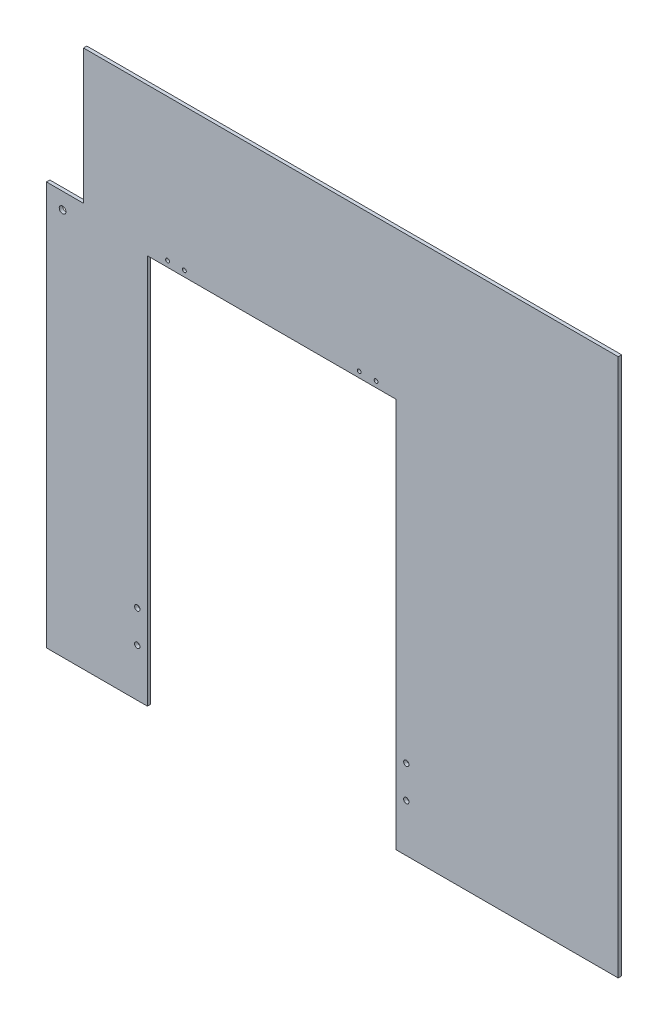
ISO-10303-21;
HEADER;
FILE_DESCRIPTION(('STEP AP214'),'2;1');
FILE_NAME('part.step','',(''),(''),'','','');
FILE_SCHEMA(('AUTOMOTIVE_DESIGN { 1 0 10303 214 1 1 1 1 }'));
ENDSEC;
DATA;
#1=APPLICATION_CONTEXT('core data for automotive mechanical design processes');
#2=APPLICATION_PROTOCOL_DEFINITION('international standard','automotive_design',2000,#1);
#3=PRODUCT_CONTEXT('',#1,'mechanical');
#4=PRODUCT('Part','Part','',(#3));
#5=PRODUCT_RELATED_PRODUCT_CATEGORY('part','',(#4));
#6=PRODUCT_DEFINITION_FORMATION('','',#4);
#7=PRODUCT_DEFINITION_CONTEXT('part definition',#1,'design');
#8=PRODUCT_DEFINITION('design','',#6,#7);
#9=PRODUCT_DEFINITION_SHAPE('','',#8);
#10=(LENGTH_UNIT() NAMED_UNIT(*) SI_UNIT(.MILLI.,.METRE.));
#11=(NAMED_UNIT(*) PLANE_ANGLE_UNIT() SI_UNIT($,.RADIAN.));
#12=(NAMED_UNIT(*) SI_UNIT($,.STERADIAN.) SOLID_ANGLE_UNIT());
#13=UNCERTAINTY_MEASURE_WITH_UNIT(LENGTH_MEASURE(1.E-05),#10,'distance_accuracy_value','');
#14=(GEOMETRIC_REPRESENTATION_CONTEXT(3) GLOBAL_UNCERTAINTY_ASSIGNED_CONTEXT((#13)) GLOBAL_UNIT_ASSIGNED_CONTEXT((#10,
#11,#12)) REPRESENTATION_CONTEXT('',''));
#15=CARTESIAN_POINT('',(0.,0.,0.));
#16=DIRECTION('',(0.,0.,1.));
#17=DIRECTION('',(1.,0.,0.));
#18=AXIS2_PLACEMENT_3D('',#15,#16,#17);
#19=CARTESIAN_POINT('',(0.,0.,3.175));
#20=DIRECTION('',(0.,1.,0.));
#21=DIRECTION('',(0.,0.,1.));
#22=AXIS2_PLACEMENT_3D('',#19,#20,#21);
#23=PLANE('',#22);
#24=DIRECTION('',(1.,0.,0.));
#25=VECTOR('',#24,1.);
#26=CARTESIAN_POINT('',(0.,0.,0.));
#27=LINE('',#26,#25);
#28=CARTESIAN_POINT('',(0.,0.,0.));
#29=VERTEX_POINT('',#28);
#30=CARTESIAN_POINT('',(95.2500000000001,-1.02649894704531E-13,0.));
#31=VERTEX_POINT('',#30);
#32=EDGE_CURVE('E162',#29,#31,#27,.T.);
#33=ORIENTED_EDGE('',*,*,#32,.T.);
#34=DIRECTION('',(0.,0.,-1.));
#35=VECTOR('',#34,1.);
#36=CARTESIAN_POINT('',(95.2500000000001,-1.02649894704531E-13,44.45));
#37=LINE('',#36,#35);
#38=CARTESIAN_POINT('',(95.2500000000001,-1.02649894704531E-13,3.175));
#39=VERTEX_POINT('',#38);
#40=EDGE_CURVE('E221',#39,#31,#37,.T.);
#41=ORIENTED_EDGE('',*,*,#40,.F.);
#42=DIRECTION('',(1.,0.,0.));
#43=VECTOR('',#42,1.);
#44=CARTESIAN_POINT('',(0.,0.,3.175));
#45=LINE('',#44,#43);
#46=CARTESIAN_POINT('',(0.,0.,3.175));
#47=VERTEX_POINT('',#46);
#48=EDGE_CURVE('E153',#47,#39,#45,.T.);
#49=ORIENTED_EDGE('',*,*,#48,.F.);
#50=DIRECTION('',(0.,0.,-1.));
#51=VECTOR('',#50,1.);
#52=CARTESIAN_POINT('',(0.,0.,3.175));
#53=LINE('',#52,#51);
#54=EDGE_CURVE('E11',#47,#29,#53,.T.);
#55=ORIENTED_EDGE('',*,*,#54,.T.);
#56=EDGE_LOOP('',(#33,#41,#49,#55));
#57=FACE_BOUND('',#56,.T.);
#58=ADVANCED_FACE('F43',(#57),#23,.F.);
#59=CARTESIAN_POINT('',(0.,0.,3.175));
#60=DIRECTION('',(1.,0.,0.));
#61=DIRECTION('',(0.,0.,-1.));
#62=AXIS2_PLACEMENT_3D('',#59,#60,#61);
#63=PLANE('',#62);
#64=DIRECTION('',(0.,-1.,0.));
#65=VECTOR('',#64,1.);
#66=CARTESIAN_POINT('',(0.,0.,3.175));
#67=LINE('',#66,#65);
#68=CARTESIAN_POINT('',(0.,381.,3.175));
#69=VERTEX_POINT('',#68);
#70=EDGE_CURVE('E170',#69,#47,#67,.T.);
#71=ORIENTED_EDGE('',*,*,#70,.F.);
#72=DIRECTION('',(0.,0.,-1.));
#73=VECTOR('',#72,1.);
#74=CARTESIAN_POINT('',(0.,381.,3.175));
#75=LINE('',#74,#73);
#76=CARTESIAN_POINT('',(0.,381.,0.));
#77=VERTEX_POINT('',#76);
#78=EDGE_CURVE('E198',#69,#77,#75,.T.);
#79=ORIENTED_EDGE('',*,*,#78,.T.);
#80=DIRECTION('',(0.,-1.,0.));
#81=VECTOR('',#80,1.);
#82=CARTESIAN_POINT('',(0.,0.,0.));
#83=LINE('',#82,#81);
#84=EDGE_CURVE('E157',#77,#29,#83,.T.);
#85=ORIENTED_EDGE('',*,*,#84,.T.);
#86=ORIENTED_EDGE('',*,*,#54,.F.);
#87=EDGE_LOOP('',(#71,#79,#85,#86));
#88=FACE_BOUND('',#87,.T.);
#89=ADVANCED_FACE('F45',(#88),#63,.F.);
#90=CARTESIAN_POINT('',(330.2,0.,3.175));
#91=VERTEX_POINT('',#90);
#92=CARTESIAN_POINT('',(539.75,0.,3.175));
#93=VERTEX_POINT('',#92);
#94=EDGE_CURVE('E278',#91,#93,#45,.T.);
#95=ORIENTED_EDGE('',*,*,#94,.F.);
#96=DIRECTION('',(0.,0.,-1.));
#97=VECTOR('',#96,1.);
#98=CARTESIAN_POINT('',(330.2,0.,44.45));
#99=LINE('',#98,#97);
#100=CARTESIAN_POINT('',(330.2,0.,0.));
#101=VERTEX_POINT('',#100);
#102=EDGE_CURVE('E234',#91,#101,#99,.T.);
#103=ORIENTED_EDGE('',*,*,#102,.T.);
#104=CARTESIAN_POINT('',(539.75,0.,0.));
#105=VERTEX_POINT('',#104);
#106=EDGE_CURVE('E160',#101,#105,#27,.T.);
#107=ORIENTED_EDGE('',*,*,#106,.T.);
#108=DIRECTION('',(0.,0.,-1.));
#109=VECTOR('',#108,1.);
#110=CARTESIAN_POINT('',(539.75,0.,3.175));
#111=LINE('',#110,#109);
#112=EDGE_CURVE('E52',#93,#105,#111,.T.);
#113=ORIENTED_EDGE('',*,*,#112,.F.);
#114=EDGE_LOOP('',(#95,#103,#107,#113));
#115=FACE_BOUND('',#114,.T.);
#116=ADVANCED_FACE('F283',(#115),#23,.F.);
#117=CARTESIAN_POINT('',(539.75,0.,3.175));
#118=DIRECTION('',(-1.,0.,0.));
#119=DIRECTION('',(0.,0.,1.));
#120=AXIS2_PLACEMENT_3D('',#117,#118,#119);
#121=PLANE('',#120);
#122=DIRECTION('',(0.,1.,0.));
#123=VECTOR('',#122,1.);
#124=CARTESIAN_POINT('',(539.75,0.,0.));
#125=LINE('',#124,#123);
#126=CARTESIAN_POINT('',(539.75,508.,0.));
#127=VERTEX_POINT('',#126);
#128=EDGE_CURVE('E166',#105,#127,#125,.T.);
#129=ORIENTED_EDGE('',*,*,#128,.T.);
#130=DIRECTION('',(0.,0.,-1.));
#131=VECTOR('',#130,1.);
#132=CARTESIAN_POINT('',(539.75,508.,3.175));
#133=LINE('',#132,#131);
#134=CARTESIAN_POINT('',(539.75,508.,3.175));
#135=VERTEX_POINT('',#134);
#136=EDGE_CURVE('E148',#135,#127,#133,.T.);
#137=ORIENTED_EDGE('',*,*,#136,.F.);
#138=DIRECTION('',(0.,1.,0.));
#139=VECTOR('',#138,1.);
#140=CARTESIAN_POINT('',(539.75,0.,3.175));
#141=LINE('',#140,#139);
#142=EDGE_CURVE('E145',#93,#135,#141,.T.);
#143=ORIENTED_EDGE('',*,*,#142,.F.);
#144=ORIENTED_EDGE('',*,*,#112,.T.);
#145=EDGE_LOOP('',(#129,#137,#143,#144));
#146=FACE_BOUND('',#145,.T.);
#147=ADVANCED_FACE('F176',(#146),#121,.F.);
#148=CARTESIAN_POINT('',(0.,508.,3.175));
#149=DIRECTION('',(0.,-1.,0.));
#150=DIRECTION('',(0.,0.,-1.));
#151=AXIS2_PLACEMENT_3D('',#148,#149,#150);
#152=PLANE('',#151);
#153=DIRECTION('',(-1.,0.,0.));
#154=VECTOR('',#153,1.);
#155=CARTESIAN_POINT('',(0.,508.,0.));
#156=LINE('',#155,#154);
#157=CARTESIAN_POINT('',(34.925,508.,0.));
#158=VERTEX_POINT('',#157);
#159=EDGE_CURVE('E139',#127,#158,#156,.T.);
#160=ORIENTED_EDGE('',*,*,#159,.T.);
#161=DIRECTION('',(0.,0.,-1.));
#162=VECTOR('',#161,1.);
#163=CARTESIAN_POINT('',(34.925,508.,3.175));
#164=LINE('',#163,#162);
#165=CARTESIAN_POINT('',(34.925,508.,3.175));
#166=VERTEX_POINT('',#165);
#167=EDGE_CURVE('E59',#166,#158,#164,.T.);
#168=ORIENTED_EDGE('',*,*,#167,.F.);
#169=DIRECTION('',(-1.,0.,0.));
#170=VECTOR('',#169,1.);
#171=CARTESIAN_POINT('',(0.,508.,3.175));
#172=LINE('',#171,#170);
#173=EDGE_CURVE('E137',#135,#166,#172,.T.);
#174=ORIENTED_EDGE('',*,*,#173,.F.);
#175=ORIENTED_EDGE('',*,*,#136,.T.);
#176=EDGE_LOOP('',(#160,#168,#174,#175));
#177=FACE_BOUND('',#176,.T.);
#178=ADVANCED_FACE('F135',(#177),#152,.F.);
#179=CARTESIAN_POINT('',(0.,0.,3.175));
#180=DIRECTION('',(0.,0.,-1.));
#181=DIRECTION('',(-1.,0.,0.));
#182=AXIS2_PLACEMENT_3D('',#179,#180,#181);
#183=PLANE('',#182);
#184=CARTESIAN_POINT('',(311.1754,373.8372,3.175));
#185=DIRECTION('',(0.,0.,-1.));
#186=DIRECTION('',(-1.,0.,0.));
#187=AXIS2_PLACEMENT_3D('',#184,#185,#186);
#188=CIRCLE('',#187,1.80340000000004);
#189=CARTESIAN_POINT('',(309.372,373.8372,3.175));
#190=VERTEX_POINT('',#189);
#191=EDGE_CURVE('E188',#190,#190,#188,.T.);
#192=ORIENTED_EDGE('',*,*,#191,.T.);
#193=EDGE_LOOP('',(#192));
#194=FACE_BOUND('',#193,.T.);
#195=CARTESIAN_POINT('',(295.3004,373.8372,3.175));
#196=DIRECTION('',(0.,0.,-1.));
#197=DIRECTION('',(-1.,0.,0.));
#198=AXIS2_PLACEMENT_3D('',#195,#196,#197);
#199=CIRCLE('',#198,1.80340000000004);
#200=CARTESIAN_POINT('',(293.497,373.8372,3.175));
#201=VERTEX_POINT('',#200);
#202=EDGE_CURVE('E532',#201,#201,#199,.T.);
#203=ORIENTED_EDGE('',*,*,#202,.T.);
#204=EDGE_LOOP('',(#203));
#205=FACE_BOUND('',#204,.T.);
#206=CARTESIAN_POINT('',(130.2004,373.8372,3.175));
#207=DIRECTION('',(0.,0.,-1.));
#208=DIRECTION('',(-1.,0.,0.));
#209=AXIS2_PLACEMENT_3D('',#206,#207,#208);
#210=CIRCLE('',#209,1.80340000000004);
#211=CARTESIAN_POINT('',(128.397,373.8372,3.175));
#212=VERTEX_POINT('',#211);
#213=EDGE_CURVE('E542',#212,#212,#210,.T.);
#214=ORIENTED_EDGE('',*,*,#213,.T.);
#215=EDGE_LOOP('',(#214));
#216=FACE_BOUND('',#215,.T.);
#217=CARTESIAN_POINT('',(114.3254,373.8372,3.175));
#218=DIRECTION('',(0.,0.,-1.));
#219=DIRECTION('',(-1.,0.,0.));
#220=AXIS2_PLACEMENT_3D('',#217,#218,#219);
#221=CIRCLE('',#220,1.80340000000004);
#222=CARTESIAN_POINT('',(112.522,373.8372,3.175));
#223=VERTEX_POINT('',#222);
#224=EDGE_CURVE('E550',#223,#223,#221,.T.);
#225=ORIENTED_EDGE('',*,*,#224,.T.);
#226=EDGE_LOOP('',(#225));
#227=FACE_BOUND('',#226,.T.);
#228=CARTESIAN_POINT('',(85.7250000000001,45.085,3.175));
#229=DIRECTION('',(0.,0.,-1.));
#230=DIRECTION('',(-1.,0.,0.));
#231=AXIS2_PLACEMENT_3D('',#228,#229,#230);
#232=CIRCLE('',#231,2.53999999999998);
#233=CARTESIAN_POINT('',(83.1850000000001,45.085,3.175));
#234=VERTEX_POINT('',#233);
#235=EDGE_CURVE('E161',#234,#234,#232,.T.);
#236=ORIENTED_EDGE('',*,*,#235,.T.);
#237=EDGE_LOOP('',(#236));
#238=FACE_BOUND('',#237,.T.);
#239=CARTESIAN_POINT('',(15.24,365.76,3.175));
#240=DIRECTION('',(0.,0.,-1.));
#241=DIRECTION('',(-1.,0.,0.));
#242=AXIS2_PLACEMENT_3D('',#239,#240,#241);
#243=CIRCLE('',#242,3.175);
#244=CARTESIAN_POINT('',(12.065,365.76,3.175));
#245=VERTEX_POINT('',#244);
#246=EDGE_CURVE('E270',#245,#245,#243,.T.);
#247=ORIENTED_EDGE('',*,*,#246,.T.);
#248=EDGE_LOOP('',(#247));
#249=FACE_BOUND('',#248,.T.);
#250=CARTESIAN_POINT('',(339.725,75.565,3.175));
#251=DIRECTION('',(0.,0.,-1.));
#252=DIRECTION('',(-1.,0.,0.));
#253=AXIS2_PLACEMENT_3D('',#250,#251,#252);
#254=CIRCLE('',#253,2.54000000000001);
#255=CARTESIAN_POINT('',(337.185,75.565,3.175));
#256=VERTEX_POINT('',#255);
#257=EDGE_CURVE('E266',#256,#256,#254,.T.);
#258=ORIENTED_EDGE('',*,*,#257,.T.);
#259=EDGE_LOOP('',(#258));
#260=FACE_BOUND('',#259,.T.);
#261=DIRECTION('',(0.,-1.,0.));
#262=VECTOR('',#261,1.);
#263=CARTESIAN_POINT('',(34.925,508.,3.175));
#264=LINE('',#263,#262);
#265=CARTESIAN_POINT('',(34.925,381.,3.175));
#266=VERTEX_POINT('',#265);
#267=EDGE_CURVE('E121',#166,#266,#264,.T.);
#268=ORIENTED_EDGE('',*,*,#267,.T.);
#269=DIRECTION('',(-1.,0.,0.));
#270=VECTOR('',#269,1.);
#271=CARTESIAN_POINT('',(0.,381.,3.175));
#272=LINE('',#271,#270);
#273=EDGE_CURVE('E129',#266,#69,#272,.T.);
#274=ORIENTED_EDGE('',*,*,#273,.T.);
#275=ORIENTED_EDGE('',*,*,#70,.T.);
#276=ORIENTED_EDGE('',*,*,#48,.T.);
#277=DIRECTION('',(0.,1.,0.));
#278=VECTOR('',#277,1.);
#279=CARTESIAN_POINT('',(95.2500000000001,0.,3.175));
#280=LINE('',#279,#278);
#281=CARTESIAN_POINT('',(95.2500000000001,368.3,3.175));
#282=VERTEX_POINT('',#281);
#283=EDGE_CURVE('E262',#39,#282,#280,.T.);
#284=ORIENTED_EDGE('',*,*,#283,.T.);
#285=DIRECTION('',(1.,0.,0.));
#286=VECTOR('',#285,1.);
#287=CARTESIAN_POINT('',(0.,368.3,3.175));
#288=LINE('',#287,#286);
#289=CARTESIAN_POINT('',(330.2,368.3,3.175));
#290=VERTEX_POINT('',#289);
#291=EDGE_CURVE('E254',#282,#290,#288,.T.);
#292=ORIENTED_EDGE('',*,*,#291,.T.);
#293=DIRECTION('',(0.,-1.,0.));
#294=VECTOR('',#293,1.);
#295=CARTESIAN_POINT('',(330.2,0.,3.175));
#296=LINE('',#295,#294);
#297=EDGE_CURVE('E258',#290,#91,#296,.T.);
#298=ORIENTED_EDGE('',*,*,#297,.T.);
#299=ORIENTED_EDGE('',*,*,#94,.T.);
#300=ORIENTED_EDGE('',*,*,#142,.T.);
#301=ORIENTED_EDGE('',*,*,#173,.T.);
#302=EDGE_LOOP('',(#268,#274,#275,#276,#284,#292,#298,#299,#300,#301));
#303=FACE_BOUND('',#302,.T.);
#304=CARTESIAN_POINT('',(85.725,75.565,3.175));
#305=DIRECTION('',(0.,0.,-1.));
#306=DIRECTION('',(-1.,0.,0.));
#307=AXIS2_PLACEMENT_3D('',#304,#305,#306);
#308=CIRCLE('',#307,2.54000000000001);
#309=CARTESIAN_POINT('',(83.185,75.565,3.175));
#310=VERTEX_POINT('',#309);
#311=EDGE_CURVE('E250',#310,#310,#308,.T.);
#312=ORIENTED_EDGE('',*,*,#311,.T.);
#313=EDGE_LOOP('',(#312));
#314=FACE_BOUND('',#313,.T.);
#315=CARTESIAN_POINT('',(339.725,45.085,3.175));
#316=DIRECTION('',(0.,0.,-1.));
#317=DIRECTION('',(-1.,0.,0.));
#318=AXIS2_PLACEMENT_3D('',#315,#316,#317);
#319=CIRCLE('',#318,2.54000000000001);
#320=CARTESIAN_POINT('',(337.185,45.085,3.175));
#321=VERTEX_POINT('',#320);
#322=EDGE_CURVE('E246',#321,#321,#319,.T.);
#323=ORIENTED_EDGE('',*,*,#322,.T.);
#324=EDGE_LOOP('',(#323));
#325=FACE_BOUND('',#324,.T.);
#326=ADVANCED_FACE('F142',(#194,#205,#216,#227,#238,#249,#260,#303,#314,#325),#183,.F.);
#327=CARTESIAN_POINT('',(0.,0.,0.));
#328=DIRECTION('',(0.,0.,-1.));
#329=DIRECTION('',(-1.,0.,0.));
#330=AXIS2_PLACEMENT_3D('',#327,#328,#329);
#331=PLANE('',#330);
#332=CARTESIAN_POINT('',(311.1754,373.8372,0.));
#333=DIRECTION('',(0.,0.,-1.));
#334=DIRECTION('',(-1.,0.,0.));
#335=AXIS2_PLACEMENT_3D('',#332,#333,#334);
#336=CIRCLE('',#335,1.80340000000004);
#337=CARTESIAN_POINT('',(309.372,373.8372,0.));
#338=VERTEX_POINT('',#337);
#339=EDGE_CURVE('E194',#338,#338,#336,.T.);
#340=ORIENTED_EDGE('',*,*,#339,.F.);
#341=EDGE_LOOP('',(#340));
#342=FACE_BOUND('',#341,.T.);
#343=CARTESIAN_POINT('',(295.3004,373.8372,0.));
#344=DIRECTION('',(0.,0.,-1.));
#345=DIRECTION('',(-1.,0.,0.));
#346=AXIS2_PLACEMENT_3D('',#343,#344,#345);
#347=CIRCLE('',#346,1.80340000000004);
#348=CARTESIAN_POINT('',(293.497,373.8372,0.));
#349=VERTEX_POINT('',#348);
#350=EDGE_CURVE('E528',#349,#349,#347,.T.);
#351=ORIENTED_EDGE('',*,*,#350,.F.);
#352=EDGE_LOOP('',(#351));
#353=FACE_BOUND('',#352,.T.);
#354=CARTESIAN_POINT('',(130.2004,373.8372,0.));
#355=DIRECTION('',(0.,0.,-1.));
#356=DIRECTION('',(-1.,0.,0.));
#357=AXIS2_PLACEMENT_3D('',#354,#355,#356);
#358=CIRCLE('',#357,1.80340000000004);
#359=CARTESIAN_POINT('',(128.397,373.8372,0.));
#360=VERTEX_POINT('',#359);
#361=EDGE_CURVE('E538',#360,#360,#358,.T.);
#362=ORIENTED_EDGE('',*,*,#361,.F.);
#363=EDGE_LOOP('',(#362));
#364=FACE_BOUND('',#363,.T.);
#365=CARTESIAN_POINT('',(114.3254,373.8372,0.));
#366=DIRECTION('',(0.,0.,-1.));
#367=DIRECTION('',(-1.,0.,0.));
#368=AXIS2_PLACEMENT_3D('',#365,#366,#367);
#369=CIRCLE('',#368,1.80340000000004);
#370=CARTESIAN_POINT('',(112.522,373.8372,0.));
#371=VERTEX_POINT('',#370);
#372=EDGE_CURVE('E546',#371,#371,#369,.T.);
#373=ORIENTED_EDGE('',*,*,#372,.F.);
#374=EDGE_LOOP('',(#373));
#375=FACE_BOUND('',#374,.T.);
#376=DIRECTION('',(-1.,0.,0.));
#377=VECTOR('',#376,1.);
#378=CARTESIAN_POINT('',(0.,381.,0.));
#379=LINE('',#378,#377);
#380=CARTESIAN_POINT('',(34.925,381.,0.));
#381=VERTEX_POINT('',#380);
#382=EDGE_CURVE('E130',#381,#77,#379,.T.);
#383=ORIENTED_EDGE('',*,*,#382,.F.);
#384=DIRECTION('',(0.,-1.,0.));
#385=VECTOR('',#384,1.);
#386=CARTESIAN_POINT('',(34.925,508.,0.));
#387=LINE('',#386,#385);
#388=EDGE_CURVE('E185',#158,#381,#387,.T.);
#389=ORIENTED_EDGE('',*,*,#388,.F.);
#390=ORIENTED_EDGE('',*,*,#159,.F.);
#391=ORIENTED_EDGE('',*,*,#128,.F.);
#392=ORIENTED_EDGE('',*,*,#106,.F.);
#393=DIRECTION('',(0.,-1.,0.));
#394=VECTOR('',#393,1.);
#395=CARTESIAN_POINT('',(330.2,0.,0.));
#396=LINE('',#395,#394);
#397=CARTESIAN_POINT('',(330.2,368.3,0.));
#398=VERTEX_POINT('',#397);
#399=EDGE_CURVE('E228',#398,#101,#396,.T.);
#400=ORIENTED_EDGE('',*,*,#399,.F.);
#401=DIRECTION('',(1.,0.,0.));
#402=VECTOR('',#401,1.);
#403=CARTESIAN_POINT('',(95.2500000000001,368.3,0.));
#404=LINE('',#403,#402);
#405=CARTESIAN_POINT('',(95.2500000000001,368.3,0.));
#406=VERTEX_POINT('',#405);
#407=EDGE_CURVE('E224',#406,#398,#404,.T.);
#408=ORIENTED_EDGE('',*,*,#407,.F.);
#409=DIRECTION('',(0.,1.,0.));
#410=VECTOR('',#409,1.);
#411=CARTESIAN_POINT('',(95.2500000000001,-1.02649894704531E-13,0.));
#412=LINE('',#411,#410);
#413=EDGE_CURVE('E67',#31,#406,#412,.T.);
#414=ORIENTED_EDGE('',*,*,#413,.F.);
#415=ORIENTED_EDGE('',*,*,#32,.F.);
#416=ORIENTED_EDGE('',*,*,#84,.F.);
#417=EDGE_LOOP('',(#383,#389,#390,#391,#392,#400,#408,#414,#415,#416));
#418=FACE_BOUND('',#417,.T.);
#419=CARTESIAN_POINT('',(85.7250000000001,45.085,0.));
#420=DIRECTION('',(0.,0.,-1.));
#421=DIRECTION('',(-1.,0.,0.));
#422=AXIS2_PLACEMENT_3D('',#419,#420,#421);
#423=CIRCLE('',#422,2.53999999999998);
#424=CARTESIAN_POINT('',(83.1850000000001,45.085,0.));
#425=VERTEX_POINT('',#424);
#426=EDGE_CURVE('E208',#425,#425,#423,.T.);
#427=ORIENTED_EDGE('',*,*,#426,.F.);
#428=EDGE_LOOP('',(#427));
#429=FACE_BOUND('',#428,.T.);
#430=CARTESIAN_POINT('',(15.24,365.76,0.));
#431=DIRECTION('',(0.,0.,-1.));
#432=DIRECTION('',(-1.,0.,0.));
#433=AXIS2_PLACEMENT_3D('',#430,#431,#432);
#434=CIRCLE('',#433,3.175);
#435=CARTESIAN_POINT('',(12.065,365.76,0.));
#436=VERTEX_POINT('',#435);
#437=EDGE_CURVE('E213',#436,#436,#434,.T.);
#438=ORIENTED_EDGE('',*,*,#437,.F.);
#439=EDGE_LOOP('',(#438));
#440=FACE_BOUND('',#439,.T.);
#441=CARTESIAN_POINT('',(339.725,75.565,0.));
#442=DIRECTION('',(0.,0.,-1.));
#443=DIRECTION('',(-1.,0.,0.));
#444=AXIS2_PLACEMENT_3D('',#441,#442,#443);
#445=CIRCLE('',#444,2.54000000000001);
#446=CARTESIAN_POINT('',(337.185,75.565,0.));
#447=VERTEX_POINT('',#446);
#448=EDGE_CURVE('E217',#447,#447,#445,.T.);
#449=ORIENTED_EDGE('',*,*,#448,.F.);
#450=EDGE_LOOP('',(#449));
#451=FACE_BOUND('',#450,.T.);
#452=CARTESIAN_POINT('',(85.725,75.565,0.));
#453=DIRECTION('',(0.,0.,-1.));
#454=DIRECTION('',(1.,0.,0.));
#455=AXIS2_PLACEMENT_3D('',#452,#453,#454);
#456=CIRCLE('',#455,2.54000000000001);
#457=CARTESIAN_POINT('',(88.265,75.565,0.));
#458=VERTEX_POINT('',#457);
#459=EDGE_CURVE('E202',#458,#458,#456,.T.);
#460=ORIENTED_EDGE('',*,*,#459,.F.);
#461=EDGE_LOOP('',(#460));
#462=FACE_BOUND('',#461,.T.);
#463=CARTESIAN_POINT('',(339.725,45.085,0.));
#464=DIRECTION('',(0.,0.,-1.));
#465=DIRECTION('',(-1.,0.,0.));
#466=AXIS2_PLACEMENT_3D('',#463,#464,#465);
#467=CIRCLE('',#466,2.54000000000001);
#468=CARTESIAN_POINT('',(337.185,45.085,0.));
#469=VERTEX_POINT('',#468);
#470=EDGE_CURVE('E212',#469,#469,#467,.T.);
#471=ORIENTED_EDGE('',*,*,#470,.F.);
#472=EDGE_LOOP('',(#471));
#473=FACE_BOUND('',#472,.T.);
#474=ADVANCED_FACE('F182',(#342,#353,#364,#375,#418,#429,#440,#451,#462,#473),#331,.T.);
#475=CARTESIAN_POINT('',(339.725,45.085,44.45));
#476=DIRECTION('',(0.,0.,-1.));
#477=DIRECTION('',(-1.,0.,0.));
#478=AXIS2_PLACEMENT_3D('',#475,#476,#477);
#479=CYLINDRICAL_SURFACE('',#478,2.54000000000001);
#480=ORIENTED_EDGE('',*,*,#470,.T.);
#481=EDGE_LOOP('',(#480));
#482=FACE_BOUND('',#481,.T.);
#483=ORIENTED_EDGE('',*,*,#322,.F.);
#484=EDGE_LOOP('',(#483));
#485=FACE_BOUND('',#484,.T.);
#486=ADVANCED_FACE('F330',(#482,#485),#479,.F.);
#487=CARTESIAN_POINT('',(85.725,75.565,44.45));
#488=DIRECTION('',(0.,0.,-1.));
#489=DIRECTION('',(-1.,0.,0.));
#490=AXIS2_PLACEMENT_3D('',#487,#488,#489);
#491=CYLINDRICAL_SURFACE('',#490,2.54000000000001);
#492=ORIENTED_EDGE('',*,*,#459,.T.);
#493=EDGE_LOOP('',(#492));
#494=FACE_BOUND('',#493,.T.);
#495=ORIENTED_EDGE('',*,*,#311,.F.);
#496=EDGE_LOOP('',(#495));
#497=FACE_BOUND('',#496,.T.);
#498=ADVANCED_FACE('F337',(#494,#497),#491,.F.);
#499=CARTESIAN_POINT('',(95.2500000000001,-1.02649894704531E-13,44.45));
#500=DIRECTION('',(-1.,0.,0.));
#501=DIRECTION('',(0.,0.,1.));
#502=AXIS2_PLACEMENT_3D('',#499,#500,#501);
#503=PLANE('',#502);
#504=ORIENTED_EDGE('',*,*,#40,.T.);
#505=ORIENTED_EDGE('',*,*,#413,.T.);
#506=DIRECTION('',(0.,0.,-1.));
#507=VECTOR('',#506,1.);
#508=CARTESIAN_POINT('',(95.2500000000001,368.3,44.45));
#509=LINE('',#508,#507);
#510=EDGE_CURVE('E231',#282,#406,#509,.T.);
#511=ORIENTED_EDGE('',*,*,#510,.F.);
#512=ORIENTED_EDGE('',*,*,#283,.F.);
#513=EDGE_LOOP('',(#504,#505,#511,#512));
#514=FACE_BOUND('',#513,.T.);
#515=ADVANCED_FACE('F291',(#514),#503,.F.);
#516=CARTESIAN_POINT('',(330.2,0.,44.45));
#517=DIRECTION('',(1.,0.,0.));
#518=DIRECTION('',(0.,0.,-1.));
#519=AXIS2_PLACEMENT_3D('',#516,#517,#518);
#520=PLANE('',#519);
#521=DIRECTION('',(0.,0.,-1.));
#522=VECTOR('',#521,1.);
#523=CARTESIAN_POINT('',(330.2,368.3,44.45));
#524=LINE('',#523,#522);
#525=EDGE_CURVE('E238',#290,#398,#524,.T.);
#526=ORIENTED_EDGE('',*,*,#525,.T.);
#527=ORIENTED_EDGE('',*,*,#399,.T.);
#528=ORIENTED_EDGE('',*,*,#102,.F.);
#529=ORIENTED_EDGE('',*,*,#297,.F.);
#530=EDGE_LOOP('',(#526,#527,#528,#529));
#531=FACE_BOUND('',#530,.T.);
#532=ADVANCED_FACE('F285',(#531),#520,.F.);
#533=CARTESIAN_POINT('',(95.2500000000001,368.3,44.45));
#534=DIRECTION('',(0.,1.,0.));
#535=DIRECTION('',(0.,0.,1.));
#536=AXIS2_PLACEMENT_3D('',#533,#534,#535);
#537=PLANE('',#536);
#538=ORIENTED_EDGE('',*,*,#510,.T.);
#539=ORIENTED_EDGE('',*,*,#407,.T.);
#540=ORIENTED_EDGE('',*,*,#525,.F.);
#541=ORIENTED_EDGE('',*,*,#291,.F.);
#542=EDGE_LOOP('',(#538,#539,#540,#541));
#543=FACE_BOUND('',#542,.T.);
#544=ADVANCED_FACE('F290',(#543),#537,.F.);
#545=CARTESIAN_POINT('',(339.725,75.565,44.45));
#546=DIRECTION('',(0.,0.,-1.));
#547=DIRECTION('',(-1.,0.,0.));
#548=AXIS2_PLACEMENT_3D('',#545,#546,#547);
#549=CYLINDRICAL_SURFACE('',#548,2.54000000000001);
#550=ORIENTED_EDGE('',*,*,#448,.T.);
#551=EDGE_LOOP('',(#550));
#552=FACE_BOUND('',#551,.T.);
#553=ORIENTED_EDGE('',*,*,#257,.F.);
#554=EDGE_LOOP('',(#553));
#555=FACE_BOUND('',#554,.T.);
#556=ADVANCED_FACE('F343',(#552,#555),#549,.F.);
#557=CARTESIAN_POINT('',(15.24,365.76,44.45));
#558=DIRECTION('',(0.,0.,-1.));
#559=DIRECTION('',(-1.,0.,0.));
#560=AXIS2_PLACEMENT_3D('',#557,#558,#559);
#561=CYLINDRICAL_SURFACE('',#560,3.175);
#562=ORIENTED_EDGE('',*,*,#437,.T.);
#563=EDGE_LOOP('',(#562));
#564=FACE_BOUND('',#563,.T.);
#565=ORIENTED_EDGE('',*,*,#246,.F.);
#566=EDGE_LOOP('',(#565));
#567=FACE_BOUND('',#566,.T.);
#568=ADVANCED_FACE('F310',(#564,#567),#561,.F.);
#569=CARTESIAN_POINT('',(85.7250000000001,45.085,44.45));
#570=DIRECTION('',(0.,0.,-1.));
#571=DIRECTION('',(-1.,0.,0.));
#572=AXIS2_PLACEMENT_3D('',#569,#570,#571);
#573=CYLINDRICAL_SURFACE('',#572,2.53999999999998);
#574=ORIENTED_EDGE('',*,*,#426,.T.);
#575=EDGE_LOOP('',(#574));
#576=FACE_BOUND('',#575,.T.);
#577=ORIENTED_EDGE('',*,*,#235,.F.);
#578=EDGE_LOOP('',(#577));
#579=FACE_BOUND('',#578,.T.);
#580=ADVANCED_FACE('F302',(#576,#579),#573,.F.);
#581=CARTESIAN_POINT('',(0.,381.,3.175));
#582=DIRECTION('',(0.,-1.,0.));
#583=DIRECTION('',(0.,0.,-1.));
#584=AXIS2_PLACEMENT_3D('',#581,#582,#583);
#585=PLANE('',#584);
#586=ORIENTED_EDGE('',*,*,#382,.T.);
#587=ORIENTED_EDGE('',*,*,#78,.F.);
#588=ORIENTED_EDGE('',*,*,#273,.F.);
#589=DIRECTION('',(0.,0.,-1.));
#590=VECTOR('',#589,1.);
#591=CARTESIAN_POINT('',(34.925,381.,3.175));
#592=LINE('',#591,#590);
#593=EDGE_CURVE('E123',#266,#381,#592,.T.);
#594=ORIENTED_EDGE('',*,*,#593,.T.);
#595=EDGE_LOOP('',(#586,#587,#588,#594));
#596=FACE_BOUND('',#595,.T.);
#597=ADVANCED_FACE('F298',(#596),#585,.F.);
#598=CARTESIAN_POINT('',(34.925,508.,3.175));
#599=DIRECTION('',(1.,0.,0.));
#600=DIRECTION('',(0.,1.,0.));
#601=AXIS2_PLACEMENT_3D('',#598,#599,#600);
#602=PLANE('',#601);
#603=ORIENTED_EDGE('',*,*,#388,.T.);
#604=ORIENTED_EDGE('',*,*,#593,.F.);
#605=ORIENTED_EDGE('',*,*,#267,.F.);
#606=ORIENTED_EDGE('',*,*,#167,.T.);
#607=EDGE_LOOP('',(#603,#604,#605,#606));
#608=FACE_BOUND('',#607,.T.);
#609=ADVANCED_FACE('F122',(#608),#602,.F.);
#610=CARTESIAN_POINT('',(114.3254,373.8372,3.175));
#611=DIRECTION('',(0.,0.,-1.));
#612=DIRECTION('',(-1.,0.,0.));
#613=AXIS2_PLACEMENT_3D('',#610,#611,#612);
#614=CYLINDRICAL_SURFACE('',#613,1.80340000000004);
#615=ORIENTED_EDGE('',*,*,#224,.F.);
#616=EDGE_LOOP('',(#615));
#617=FACE_BOUND('',#616,.T.);
#618=ORIENTED_EDGE('',*,*,#372,.T.);
#619=EDGE_LOOP('',(#618));
#620=FACE_BOUND('',#619,.T.);
#621=ADVANCED_FACE('F308',(#617,#620),#614,.F.);
#622=CARTESIAN_POINT('',(130.2004,373.8372,3.175));
#623=DIRECTION('',(0.,0.,-1.));
#624=DIRECTION('',(-1.,0.,0.));
#625=AXIS2_PLACEMENT_3D('',#622,#623,#624);
#626=CYLINDRICAL_SURFACE('',#625,1.80340000000004);
#627=ORIENTED_EDGE('',*,*,#213,.F.);
#628=EDGE_LOOP('',(#627));
#629=FACE_BOUND('',#628,.T.);
#630=ORIENTED_EDGE('',*,*,#361,.T.);
#631=EDGE_LOOP('',(#630));
#632=FACE_BOUND('',#631,.T.);
#633=ADVANCED_FACE('F440',(#629,#632),#626,.F.);
#634=CARTESIAN_POINT('',(295.3004,373.8372,3.175));
#635=DIRECTION('',(0.,0.,-1.));
#636=DIRECTION('',(-1.,0.,0.));
#637=AXIS2_PLACEMENT_3D('',#634,#635,#636);
#638=CYLINDRICAL_SURFACE('',#637,1.80340000000004);
#639=ORIENTED_EDGE('',*,*,#202,.F.);
#640=EDGE_LOOP('',(#639));
#641=FACE_BOUND('',#640,.T.);
#642=ORIENTED_EDGE('',*,*,#350,.T.);
#643=EDGE_LOOP('',(#642));
#644=FACE_BOUND('',#643,.T.);
#645=ADVANCED_FACE('F450',(#641,#644),#638,.F.);
#646=CARTESIAN_POINT('',(311.1754,373.8372,3.175));
#647=DIRECTION('',(0.,0.,-1.));
#648=DIRECTION('',(-1.,0.,0.));
#649=AXIS2_PLACEMENT_3D('',#646,#647,#648);
#650=CYLINDRICAL_SURFACE('',#649,1.80340000000004);
#651=ORIENTED_EDGE('',*,*,#191,.F.);
#652=EDGE_LOOP('',(#651));
#653=FACE_BOUND('',#652,.T.);
#654=ORIENTED_EDGE('',*,*,#339,.T.);
#655=EDGE_LOOP('',(#654));
#656=FACE_BOUND('',#655,.T.);
#657=ADVANCED_FACE('F461',(#653,#656),#650,.F.);
#658=CLOSED_SHELL('',(#58,#89,#116,#147,#178,#326,#474,#486,#498,#515,#532,#544,#556,#568,#580,
#597,#609,#621,#633,#645,#657));
#659=MANIFOLD_SOLID_BREP('B2',#658);
#660=ADVANCED_BREP_SHAPE_REPRESENTATION('',(#18,#659),#14);
#661=SHAPE_DEFINITION_REPRESENTATION(#9,#660);
ENDSEC;
END-ISO-10303-21;
